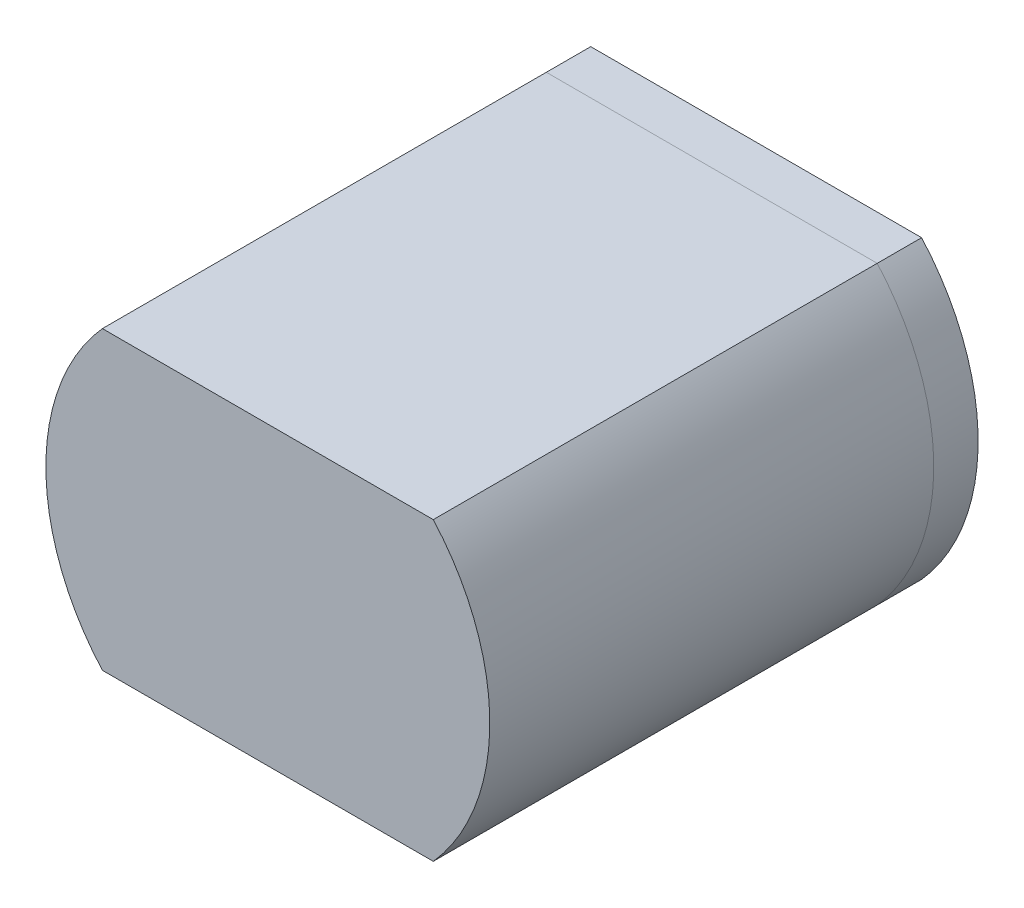
ISO-10303-21;
HEADER;
FILE_DESCRIPTION(('STEP AP214'),'2;1');
FILE_NAME('part.step','',(''),(''),'','','');
FILE_SCHEMA(('AUTOMOTIVE_DESIGN { 1 0 10303 214 1 1 1 1 }'));
ENDSEC;
DATA;
#1=APPLICATION_CONTEXT('core data for automotive mechanical design processes');
#2=APPLICATION_PROTOCOL_DEFINITION('international standard','automotive_design',2000,#1);
#3=PRODUCT_CONTEXT('',#1,'mechanical');
#4=PRODUCT('Part','Part','',(#3));
#5=PRODUCT_RELATED_PRODUCT_CATEGORY('part','',(#4));
#6=PRODUCT_DEFINITION_FORMATION('','',#4);
#7=PRODUCT_DEFINITION_CONTEXT('part definition',#1,'design');
#8=PRODUCT_DEFINITION('design','',#6,#7);
#9=PRODUCT_DEFINITION_SHAPE('','',#8);
#10=(LENGTH_UNIT() NAMED_UNIT(*) SI_UNIT(.MILLI.,.METRE.));
#11=(NAMED_UNIT(*) PLANE_ANGLE_UNIT() SI_UNIT($,.RADIAN.));
#12=(NAMED_UNIT(*) SI_UNIT($,.STERADIAN.) SOLID_ANGLE_UNIT());
#13=UNCERTAINTY_MEASURE_WITH_UNIT(LENGTH_MEASURE(1.E-05),#10,'distance_accuracy_value','');
#14=(GEOMETRIC_REPRESENTATION_CONTEXT(3) GLOBAL_UNCERTAINTY_ASSIGNED_CONTEXT((#13)) GLOBAL_UNIT_ASSIGNED_CONTEXT((#10,
#11,#12)) REPRESENTATION_CONTEXT('',''));
#15=CARTESIAN_POINT('',(0.,0.,0.));
#16=DIRECTION('',(0.,0.,1.));
#17=DIRECTION('',(1.,0.,0.));
#18=AXIS2_PLACEMENT_3D('',#15,#16,#17);
#19=CARTESIAN_POINT('',(0.,0.,-1.5));
#20=DIRECTION('',(0.,0.,1.));
#21=DIRECTION('',(1.,0.,0.));
#22=AXIS2_PLACEMENT_3D('',#19,#20,#21);
#23=CYLINDRICAL_SURFACE('',#22,7.5);
#24=CARTESIAN_POINT('',(0.,0.,0.));
#25=DIRECTION('',(0.,0.,-1.));
#26=DIRECTION('',(-1.,0.,0.));
#27=AXIS2_PLACEMENT_3D('',#24,#25,#26);
#28=CIRCLE('',#27,7.5);
#29=CARTESIAN_POINT('',(-5.59016994374948,-5.,0.));
#30=VERTEX_POINT('',#29);
#31=CARTESIAN_POINT('',(-5.59016994374947,5.,0.));
#32=VERTEX_POINT('',#31);
#33=EDGE_CURVE('E106',#30,#32,#28,.T.);
#34=ORIENTED_EDGE('',*,*,#33,.T.);
#35=DIRECTION('',(0.,0.,1.));
#36=VECTOR('',#35,1.);
#37=CARTESIAN_POINT('',(-5.59016994374947,5.,-1.5));
#38=LINE('',#37,#36);
#39=CARTESIAN_POINT('',(-5.59016994374947,5.,-1.5));
#40=VERTEX_POINT('',#39);
#41=EDGE_CURVE('E12',#40,#32,#38,.T.);
#42=ORIENTED_EDGE('',*,*,#41,.F.);
#43=CARTESIAN_POINT('',(0.,0.,-1.5));
#44=DIRECTION('',(0.,0.,-1.));
#45=DIRECTION('',(-1.,0.,0.));
#46=AXIS2_PLACEMENT_3D('',#43,#44,#45);
#47=CIRCLE('',#46,7.5);
#48=CARTESIAN_POINT('',(-5.59016994374948,-5.,-1.5));
#49=VERTEX_POINT('',#48);
#50=EDGE_CURVE('E94',#49,#40,#47,.T.);
#51=ORIENTED_EDGE('',*,*,#50,.F.);
#52=DIRECTION('',(0.,0.,1.));
#53=VECTOR('',#52,1.);
#54=CARTESIAN_POINT('',(-5.59016994374948,-5.,-1.5));
#55=LINE('',#54,#53);
#56=EDGE_CURVE('E102',#49,#30,#55,.T.);
#57=ORIENTED_EDGE('',*,*,#56,.T.);
#58=EDGE_LOOP('',(#34,#42,#51,#57));
#59=FACE_BOUND('',#58,.T.);
#60=ADVANCED_FACE('F43',(#59),#23,.T.);
#61=CARTESIAN_POINT('',(5.59016994374947,5.,-1.5));
#62=DIRECTION('',(0.,-1.,0.));
#63=DIRECTION('',(1.,0.,0.));
#64=AXIS2_PLACEMENT_3D('',#61,#62,#63);
#65=PLANE('',#64);
#66=DIRECTION('',(1.,0.,0.));
#67=VECTOR('',#66,1.);
#68=CARTESIAN_POINT('',(5.59016994374947,5.,0.));
#69=LINE('',#68,#67);
#70=CARTESIAN_POINT('',(5.59016994374947,5.,0.));
#71=VERTEX_POINT('',#70);
#72=EDGE_CURVE('E98',#32,#71,#69,.T.);
#73=ORIENTED_EDGE('',*,*,#72,.T.);
#74=DIRECTION('',(0.,0.,1.));
#75=VECTOR('',#74,1.);
#76=CARTESIAN_POINT('',(5.59016994374947,5.,-1.5));
#77=LINE('',#76,#75);
#78=CARTESIAN_POINT('',(5.59016994374947,5.,-1.5));
#79=VERTEX_POINT('',#78);
#80=EDGE_CURVE('E51',#79,#71,#77,.T.);
#81=ORIENTED_EDGE('',*,*,#80,.F.);
#82=DIRECTION('',(1.,0.,0.));
#83=VECTOR('',#82,1.);
#84=CARTESIAN_POINT('',(5.59016994374947,5.,-1.5));
#85=LINE('',#84,#83);
#86=EDGE_CURVE('E89',#40,#79,#85,.T.);
#87=ORIENTED_EDGE('',*,*,#86,.F.);
#88=ORIENTED_EDGE('',*,*,#41,.T.);
#89=EDGE_LOOP('',(#73,#81,#87,#88));
#90=FACE_BOUND('',#89,.T.);
#91=ADVANCED_FACE('F97',(#90),#65,.F.);
#92=CARTESIAN_POINT('',(0.,0.,-1.5));
#93=DIRECTION('',(0.,0.,1.));
#94=DIRECTION('',(1.,0.,0.));
#95=AXIS2_PLACEMENT_3D('',#92,#93,#94);
#96=CYLINDRICAL_SURFACE('',#95,7.5);
#97=CARTESIAN_POINT('',(0.,0.,0.));
#98=DIRECTION('',(0.,0.,-1.));
#99=DIRECTION('',(-1.,0.,0.));
#100=AXIS2_PLACEMENT_3D('',#97,#98,#99);
#101=CIRCLE('',#100,7.5);
#102=CARTESIAN_POINT('',(5.59016994374948,-5.,0.));
#103=VERTEX_POINT('',#102);
#104=EDGE_CURVE('E76',#71,#103,#101,.T.);
#105=ORIENTED_EDGE('',*,*,#104,.T.);
#106=DIRECTION('',(0.,0.,1.));
#107=VECTOR('',#106,1.);
#108=CARTESIAN_POINT('',(5.59016994374948,-5.,-1.5));
#109=LINE('',#108,#107);
#110=CARTESIAN_POINT('',(5.59016994374948,-5.,-1.5));
#111=VERTEX_POINT('',#110);
#112=EDGE_CURVE('E99',#111,#103,#109,.T.);
#113=ORIENTED_EDGE('',*,*,#112,.F.);
#114=CARTESIAN_POINT('',(0.,0.,-1.5));
#115=DIRECTION('',(0.,0.,-1.));
#116=DIRECTION('',(-1.,0.,0.));
#117=AXIS2_PLACEMENT_3D('',#114,#115,#116);
#118=CIRCLE('',#117,7.5);
#119=EDGE_CURVE('E92',#79,#111,#118,.T.);
#120=ORIENTED_EDGE('',*,*,#119,.F.);
#121=ORIENTED_EDGE('',*,*,#80,.T.);
#122=EDGE_LOOP('',(#105,#113,#120,#121));
#123=FACE_BOUND('',#122,.T.);
#124=ADVANCED_FACE('F100',(#123),#96,.T.);
#125=CARTESIAN_POINT('',(-5.59016994374948,-5.,-1.5));
#126=DIRECTION('',(0.,1.,0.));
#127=DIRECTION('',(0.,0.,1.));
#128=AXIS2_PLACEMENT_3D('',#125,#126,#127);
#129=PLANE('',#128);
#130=DIRECTION('',(-1.,0.,0.));
#131=VECTOR('',#130,1.);
#132=CARTESIAN_POINT('',(-5.59016994374948,-5.,0.));
#133=LINE('',#132,#131);
#134=EDGE_CURVE('E82',#103,#30,#133,.T.);
#135=ORIENTED_EDGE('',*,*,#134,.T.);
#136=ORIENTED_EDGE('',*,*,#56,.F.);
#137=DIRECTION('',(-1.,0.,0.));
#138=VECTOR('',#137,1.);
#139=CARTESIAN_POINT('',(-5.59016994374948,-5.,-1.5));
#140=LINE('',#139,#138);
#141=EDGE_CURVE('E59',#111,#49,#140,.T.);
#142=ORIENTED_EDGE('',*,*,#141,.F.);
#143=ORIENTED_EDGE('',*,*,#112,.T.);
#144=EDGE_LOOP('',(#135,#136,#142,#143));
#145=FACE_BOUND('',#144,.T.);
#146=ADVANCED_FACE('F113',(#145),#129,.F.);
#147=CARTESIAN_POINT('',(0.,0.,-1.5));
#148=DIRECTION('',(0.,0.,-1.));
#149=DIRECTION('',(-1.,0.,0.));
#150=AXIS2_PLACEMENT_3D('',#147,#148,#149);
#151=PLANE('',#150);
#152=ORIENTED_EDGE('',*,*,#50,.T.);
#153=ORIENTED_EDGE('',*,*,#86,.T.);
#154=ORIENTED_EDGE('',*,*,#119,.T.);
#155=ORIENTED_EDGE('',*,*,#141,.T.);
#156=EDGE_LOOP('',(#152,#153,#154,#155));
#157=FACE_BOUND('',#156,.T.);
#158=ADVANCED_FACE('F90',(#157),#151,.T.);
#159=CARTESIAN_POINT('',(0.,0.,0.));
#160=DIRECTION('',(0.,0.,-1.));
#161=DIRECTION('',(-1.,0.,0.));
#162=AXIS2_PLACEMENT_3D('',#159,#160,#161);
#163=PLANE('',#162);
#164=ORIENTED_EDGE('',*,*,#33,.F.);
#165=ORIENTED_EDGE('',*,*,#134,.F.);
#166=ORIENTED_EDGE('',*,*,#104,.F.);
#167=ORIENTED_EDGE('',*,*,#72,.F.);
#168=EDGE_LOOP('',(#164,#165,#166,#167));
#169=FACE_BOUND('',#168,.T.);
#170=ADVANCED_FACE('F116',(#169),#163,.F.);
#171=CLOSED_SHELL('',(#60,#91,#124,#146,#158,#170));
#172=MANIFOLD_SOLID_BREP('B2',#171);
#173=CARTESIAN_POINT('',(0.,0.,15.));
#174=DIRECTION('',(0.,0.,-1.));
#175=DIRECTION('',(-1.,0.,0.));
#176=AXIS2_PLACEMENT_3D('',#173,#174,#175);
#177=CYLINDRICAL_SURFACE('',#176,7.5);
#178=CARTESIAN_POINT('',(0.,0.,0.));
#179=DIRECTION('',(0.,0.,1.));
#180=DIRECTION('',(1.,0.,0.));
#181=AXIS2_PLACEMENT_3D('',#178,#179,#180);
#182=CIRCLE('',#181,7.5);
#183=CARTESIAN_POINT('',(-5.59016994374947,5.,0.));
#184=VERTEX_POINT('',#183);
#185=CARTESIAN_POINT('',(-5.59016994374948,-5.,0.));
#186=VERTEX_POINT('',#185);
#187=EDGE_CURVE('E230',#184,#186,#182,.T.);
#188=ORIENTED_EDGE('',*,*,#187,.T.);
#189=DIRECTION('',(0.,0.,-1.));
#190=VECTOR('',#189,1.);
#191=CARTESIAN_POINT('',(-5.59016994374948,-5.,15.));
#192=LINE('',#191,#190);
#193=CARTESIAN_POINT('',(-5.59016994374948,-5.,15.));
#194=VERTEX_POINT('',#193);
#195=EDGE_CURVE('E41',#194,#186,#192,.T.);
#196=ORIENTED_EDGE('',*,*,#195,.F.);
#197=CARTESIAN_POINT('',(0.,0.,15.));
#198=DIRECTION('',(0.,0.,1.));
#199=DIRECTION('',(1.,0.,0.));
#200=AXIS2_PLACEMENT_3D('',#197,#198,#199);
#201=CIRCLE('',#200,7.5);
#202=CARTESIAN_POINT('',(-5.59016994374947,5.,15.));
#203=VERTEX_POINT('',#202);
#204=EDGE_CURVE('E218',#203,#194,#201,.T.);
#205=ORIENTED_EDGE('',*,*,#204,.F.);
#206=DIRECTION('',(0.,0.,-1.));
#207=VECTOR('',#206,1.);
#208=CARTESIAN_POINT('',(-5.59016994374947,5.,15.));
#209=LINE('',#208,#207);
#210=EDGE_CURVE('E226',#203,#184,#209,.T.);
#211=ORIENTED_EDGE('',*,*,#210,.T.);
#212=EDGE_LOOP('',(#188,#196,#205,#211));
#213=FACE_BOUND('',#212,.T.);
#214=ADVANCED_FACE('F167',(#213),#177,.T.);
#215=CARTESIAN_POINT('',(-5.59016994374948,-5.,15.));
#216=DIRECTION('',(0.,1.,0.));
#217=DIRECTION('',(0.,0.,1.));
#218=AXIS2_PLACEMENT_3D('',#215,#216,#217);
#219=PLANE('',#218);
#220=DIRECTION('',(1.,0.,0.));
#221=VECTOR('',#220,1.);
#222=CARTESIAN_POINT('',(-5.59016994374948,-5.,0.));
#223=LINE('',#222,#221);
#224=CARTESIAN_POINT('',(5.59016994374948,-5.,0.));
#225=VERTEX_POINT('',#224);
#226=EDGE_CURVE('E222',#186,#225,#223,.T.);
#227=ORIENTED_EDGE('',*,*,#226,.T.);
#228=DIRECTION('',(0.,0.,-1.));
#229=VECTOR('',#228,1.);
#230=CARTESIAN_POINT('',(5.59016994374948,-5.,15.));
#231=LINE('',#230,#229);
#232=CARTESIAN_POINT('',(5.59016994374948,-5.,15.));
#233=VERTEX_POINT('',#232);
#234=EDGE_CURVE('E175',#233,#225,#231,.T.);
#235=ORIENTED_EDGE('',*,*,#234,.F.);
#236=DIRECTION('',(1.,0.,0.));
#237=VECTOR('',#236,1.);
#238=CARTESIAN_POINT('',(-5.59016994374948,-5.,15.));
#239=LINE('',#238,#237);
#240=EDGE_CURVE('E213',#194,#233,#239,.T.);
#241=ORIENTED_EDGE('',*,*,#240,.F.);
#242=ORIENTED_EDGE('',*,*,#195,.T.);
#243=EDGE_LOOP('',(#227,#235,#241,#242));
#244=FACE_BOUND('',#243,.T.);
#245=ADVANCED_FACE('F221',(#244),#219,.F.);
#246=CARTESIAN_POINT('',(0.,0.,15.));
#247=DIRECTION('',(0.,0.,-1.));
#248=DIRECTION('',(-1.,0.,0.));
#249=AXIS2_PLACEMENT_3D('',#246,#247,#248);
#250=CYLINDRICAL_SURFACE('',#249,7.5);
#251=CARTESIAN_POINT('',(0.,0.,0.));
#252=DIRECTION('',(0.,0.,1.));
#253=DIRECTION('',(1.,0.,0.));
#254=AXIS2_PLACEMENT_3D('',#251,#252,#253);
#255=CIRCLE('',#254,7.5);
#256=CARTESIAN_POINT('',(5.59016994374947,5.,0.));
#257=VERTEX_POINT('',#256);
#258=EDGE_CURVE('E200',#225,#257,#255,.T.);
#259=ORIENTED_EDGE('',*,*,#258,.T.);
#260=DIRECTION('',(0.,0.,-1.));
#261=VECTOR('',#260,1.);
#262=CARTESIAN_POINT('',(5.59016994374947,5.,15.));
#263=LINE('',#262,#261);
#264=CARTESIAN_POINT('',(5.59016994374947,5.,15.));
#265=VERTEX_POINT('',#264);
#266=EDGE_CURVE('E223',#265,#257,#263,.T.);
#267=ORIENTED_EDGE('',*,*,#266,.F.);
#268=CARTESIAN_POINT('',(0.,0.,15.));
#269=DIRECTION('',(0.,0.,1.));
#270=DIRECTION('',(1.,0.,0.));
#271=AXIS2_PLACEMENT_3D('',#268,#269,#270);
#272=CIRCLE('',#271,7.5);
#273=EDGE_CURVE('E216',#233,#265,#272,.T.);
#274=ORIENTED_EDGE('',*,*,#273,.F.);
#275=ORIENTED_EDGE('',*,*,#234,.T.);
#276=EDGE_LOOP('',(#259,#267,#274,#275));
#277=FACE_BOUND('',#276,.T.);
#278=ADVANCED_FACE('F224',(#277),#250,.T.);
#279=CARTESIAN_POINT('',(-5.59016994374947,5.,15.));
#280=DIRECTION('',(0.,-1.,0.));
#281=DIRECTION('',(0.,0.,-1.));
#282=AXIS2_PLACEMENT_3D('',#279,#280,#281);
#283=PLANE('',#282);
#284=DIRECTION('',(-1.,0.,0.));
#285=VECTOR('',#284,1.);
#286=CARTESIAN_POINT('',(-5.59016994374947,5.,0.));
#287=LINE('',#286,#285);
#288=EDGE_CURVE('E206',#257,#184,#287,.T.);
#289=ORIENTED_EDGE('',*,*,#288,.T.);
#290=ORIENTED_EDGE('',*,*,#210,.F.);
#291=DIRECTION('',(-1.,0.,0.));
#292=VECTOR('',#291,1.);
#293=CARTESIAN_POINT('',(-5.59016994374947,5.,15.));
#294=LINE('',#293,#292);
#295=EDGE_CURVE('E183',#265,#203,#294,.T.);
#296=ORIENTED_EDGE('',*,*,#295,.F.);
#297=ORIENTED_EDGE('',*,*,#266,.T.);
#298=EDGE_LOOP('',(#289,#290,#296,#297));
#299=FACE_BOUND('',#298,.T.);
#300=ADVANCED_FACE('F237',(#299),#283,.F.);
#301=CARTESIAN_POINT('',(0.,0.,15.));
#302=DIRECTION('',(0.,0.,1.));
#303=DIRECTION('',(1.,0.,0.));
#304=AXIS2_PLACEMENT_3D('',#301,#302,#303);
#305=PLANE('',#304);
#306=ORIENTED_EDGE('',*,*,#204,.T.);
#307=ORIENTED_EDGE('',*,*,#240,.T.);
#308=ORIENTED_EDGE('',*,*,#273,.T.);
#309=ORIENTED_EDGE('',*,*,#295,.T.);
#310=EDGE_LOOP('',(#306,#307,#308,#309));
#311=FACE_BOUND('',#310,.T.);
#312=ADVANCED_FACE('F214',(#311),#305,.T.);
#313=CARTESIAN_POINT('',(0.,0.,0.));
#314=DIRECTION('',(0.,0.,1.));
#315=DIRECTION('',(1.,0.,0.));
#316=AXIS2_PLACEMENT_3D('',#313,#314,#315);
#317=PLANE('',#316);
#318=ORIENTED_EDGE('',*,*,#187,.F.);
#319=ORIENTED_EDGE('',*,*,#288,.F.);
#320=ORIENTED_EDGE('',*,*,#258,.F.);
#321=ORIENTED_EDGE('',*,*,#226,.F.);
#322=EDGE_LOOP('',(#318,#319,#320,#321));
#323=FACE_BOUND('',#322,.T.);
#324=ADVANCED_FACE('F240',(#323),#317,.F.);
#325=CLOSED_SHELL('',(#214,#245,#278,#300,#312,#324));
#326=MANIFOLD_SOLID_BREP('B6',#325);
#327=ADVANCED_BREP_SHAPE_REPRESENTATION('',(#18,#172,#326),#14);
#328=SHAPE_DEFINITION_REPRESENTATION(#9,#327);
ENDSEC;
END-ISO-10303-21;
